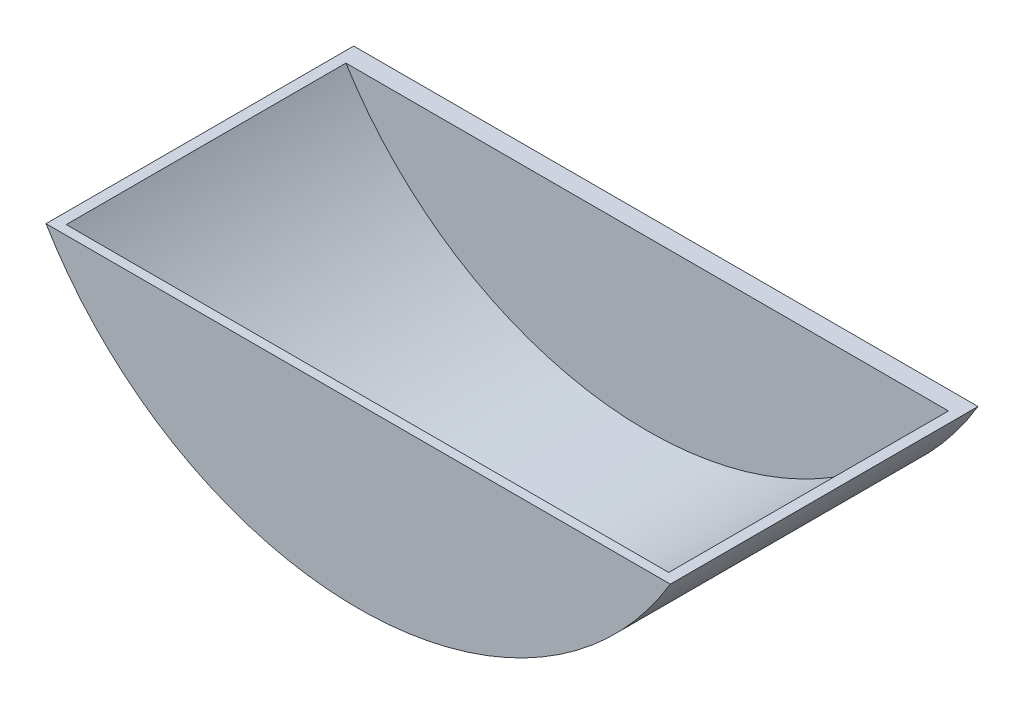
ISO-10303-21;
HEADER;
FILE_DESCRIPTION(('STEP AP214'),'2;1');
FILE_NAME('part.step','',(''),(''),'','','');
FILE_SCHEMA(('AUTOMOTIVE_DESIGN { 1 0 10303 214 1 1 1 1 }'));
ENDSEC;
DATA;
#1=APPLICATION_CONTEXT('core data for automotive mechanical design processes');
#2=APPLICATION_PROTOCOL_DEFINITION('international standard','automotive_design',2000,#1);
#3=PRODUCT_CONTEXT('',#1,'mechanical');
#4=PRODUCT('Part','Part','',(#3));
#5=PRODUCT_RELATED_PRODUCT_CATEGORY('part','',(#4));
#6=PRODUCT_DEFINITION_FORMATION('','',#4);
#7=PRODUCT_DEFINITION_CONTEXT('part definition',#1,'design');
#8=PRODUCT_DEFINITION('design','',#6,#7);
#9=PRODUCT_DEFINITION_SHAPE('','',#8);
#10=(LENGTH_UNIT() NAMED_UNIT(*) SI_UNIT(.MILLI.,.METRE.));
#11=(NAMED_UNIT(*) PLANE_ANGLE_UNIT() SI_UNIT($,.RADIAN.));
#12=(NAMED_UNIT(*) SI_UNIT($,.STERADIAN.) SOLID_ANGLE_UNIT());
#13=UNCERTAINTY_MEASURE_WITH_UNIT(LENGTH_MEASURE(1.E-05),#10,'distance_accuracy_value','');
#14=(GEOMETRIC_REPRESENTATION_CONTEXT(3) GLOBAL_UNCERTAINTY_ASSIGNED_CONTEXT((#13)) GLOBAL_UNIT_ASSIGNED_CONTEXT((#10,
#11,#12)) REPRESENTATION_CONTEXT('',''));
#15=CARTESIAN_POINT('',(0.,0.,0.));
#16=DIRECTION('',(0.,0.,1.));
#17=DIRECTION('',(1.,0.,0.));
#18=AXIS2_PLACEMENT_3D('',#15,#16,#17);
#19=CARTESIAN_POINT('',(0.,0.,-10.));
#20=DIRECTION('',(0.,0.,-1.));
#21=DIRECTION('',(-1.,0.,0.));
#22=AXIS2_PLACEMENT_3D('',#19,#20,#21);
#23=PLANE('',#22);
#24=CARTESIAN_POINT('',(0.,0.,-10.));
#25=DIRECTION('',(0.,0.,-1.));
#26=DIRECTION('',(-1.,0.,0.));
#27=AXIS2_PLACEMENT_3D('',#24,#25,#26);
#28=CIRCLE('',#27,195.);
#29=CARTESIAN_POINT('',(167.406690427832,-100.,-10.));
#30=VERTEX_POINT('',#29);
#31=CARTESIAN_POINT('',(-167.406690427832,-100.,-10.));
#32=VERTEX_POINT('',#31);
#33=EDGE_CURVE('E165',#30,#32,#28,.T.);
#34=ORIENTED_EDGE('',*,*,#33,.T.);
#35=DIRECTION('',(1.,0.,0.));
#36=VECTOR('',#35,1.);
#37=CARTESIAN_POINT('',(167.406690427832,-100.,-10.));
#38=LINE('',#37,#36);
#39=EDGE_CURVE('E168',#32,#30,#38,.T.);
#40=ORIENTED_EDGE('',*,*,#39,.T.);
#41=EDGE_LOOP('',(#34,#40));
#42=FACE_BOUND('',#41,.T.);
#43=DIRECTION('',(-1.,0.,0.));
#44=VECTOR('',#43,1.);
#45=CARTESIAN_POINT('',(-25.0000000000001,-134.59381339713,-10.));
#46=LINE('',#45,#44);
#47=CARTESIAN_POINT('',(25.9999999999999,-134.59381339713,-10.));
#48=VERTEX_POINT('',#47);
#49=CARTESIAN_POINT('',(-26.0000000000001,-134.59381339713,-10.));
#50=VERTEX_POINT('',#49);
#51=EDGE_CURVE('E192',#48,#50,#46,.T.);
#52=ORIENTED_EDGE('',*,*,#51,.T.);
#53=DIRECTION('',(0.,1.,0.));
#54=VECTOR('',#53,1.);
#55=CARTESIAN_POINT('',(-26.0000000000001,-150.293943782804,-10.));
#56=LINE('',#55,#54);
#57=CARTESIAN_POINT('',(-26.0000000000001,-151.293943782804,-10.));
#58=VERTEX_POINT('',#57);
#59=EDGE_CURVE('E207',#50,#58,#56,.F.);
#60=ORIENTED_EDGE('',*,*,#59,.T.);
#61=DIRECTION('',(-1.,0.,0.));
#62=VECTOR('',#61,1.);
#63=CARTESIAN_POINT('',(24.9999999999999,-151.293943782804,-10.));
#64=LINE('',#63,#62);
#65=CARTESIAN_POINT('',(25.9999999999999,-151.293943782804,-10.));
#66=VERTEX_POINT('',#65);
#67=EDGE_CURVE('E205',#58,#66,#64,.F.);
#68=ORIENTED_EDGE('',*,*,#67,.T.);
#69=DIRECTION('',(0.,1.,0.));
#70=VECTOR('',#69,1.);
#71=CARTESIAN_POINT('',(25.9999999999999,0.,-10.));
#72=LINE('',#71,#70);
#73=EDGE_CURVE('E202',#66,#48,#72,.T.);
#74=ORIENTED_EDGE('',*,*,#73,.T.);
#75=EDGE_LOOP('',(#52,#60,#68,#74));
#76=FACE_BOUND('',#75,.T.);
#77=ADVANCED_FACE('F40',(#42,#76),#23,.T.);
#78=CARTESIAN_POINT('',(0.,0.,150.));
#79=DIRECTION('',(0.,0.,-1.));
#80=DIRECTION('',(-1.,0.,0.));
#81=AXIS2_PLACEMENT_3D('',#78,#79,#80);
#82=CYLINDRICAL_SURFACE('',#81,190.);
#83=CARTESIAN_POINT('',(0.,0.,0.));
#84=DIRECTION('',(0.,0.,1.));
#85=DIRECTION('',(1.,0.,0.));
#86=AXIS2_PLACEMENT_3D('',#83,#84,#85);
#87=CIRCLE('',#86,190.);
#88=CARTESIAN_POINT('',(-161.554944214035,-100.,0.));
#89=VERTEX_POINT('',#88);
#90=CARTESIAN_POINT('',(161.554944214035,-100.,0.));
#91=VERTEX_POINT('',#90);
#92=EDGE_CURVE('E171',#89,#91,#87,.T.);
#93=ORIENTED_EDGE('',*,*,#92,.F.);
#94=DIRECTION('',(0.,0.,-1.));
#95=VECTOR('',#94,1.);
#96=CARTESIAN_POINT('',(-161.554944214035,-100.,150.));
#97=LINE('',#96,#95);
#98=CARTESIAN_POINT('',(-161.554944214035,-100.,150.));
#99=VERTEX_POINT('',#98);
#100=EDGE_CURVE('E185',#99,#89,#97,.T.);
#101=ORIENTED_EDGE('',*,*,#100,.F.);
#102=CARTESIAN_POINT('',(0.,0.,150.));
#103=DIRECTION('',(0.,0.,1.));
#104=DIRECTION('',(1.,0.,0.));
#105=AXIS2_PLACEMENT_3D('',#102,#103,#104);
#106=CIRCLE('',#105,190.);
#107=CARTESIAN_POINT('',(161.554944214035,-100.,150.));
#108=VERTEX_POINT('',#107);
#109=EDGE_CURVE('E174',#99,#108,#106,.T.);
#110=ORIENTED_EDGE('',*,*,#109,.T.);
#111=DIRECTION('',(0.,0.,-1.));
#112=VECTOR('',#111,1.);
#113=CARTESIAN_POINT('',(161.554944214035,-100.,150.));
#114=LINE('',#113,#112);
#115=EDGE_CURVE('E177',#108,#91,#114,.T.);
#116=ORIENTED_EDGE('',*,*,#115,.T.);
#117=EDGE_LOOP('',(#93,#101,#110,#116));
#118=FACE_BOUND('',#117,.T.);
#119=ADVANCED_FACE('F238',(#118),#82,.F.);
#120=CARTESIAN_POINT('',(0.,0.,150.));
#121=DIRECTION('',(0.,0.,-1.));
#122=DIRECTION('',(-1.,0.,0.));
#123=AXIS2_PLACEMENT_3D('',#120,#121,#122);
#124=CYLINDRICAL_SURFACE('',#123,195.);
#125=DIRECTION('',(0.,0.,-1.));
#126=VECTOR('',#125,1.);
#127=CARTESIAN_POINT('',(-167.406690427832,-100.,150.));
#128=LINE('',#127,#126);
#129=CARTESIAN_POINT('',(-167.406690427832,-100.,155.));
#130=VERTEX_POINT('',#129);
#131=EDGE_CURVE('E183',#130,#32,#128,.T.);
#132=ORIENTED_EDGE('',*,*,#131,.T.);
#133=ORIENTED_EDGE('',*,*,#33,.F.);
#134=DIRECTION('',(0.,0.,-1.));
#135=VECTOR('',#134,1.);
#136=CARTESIAN_POINT('',(167.406690427832,-100.,150.));
#137=LINE('',#136,#135);
#138=CARTESIAN_POINT('',(167.406690427832,-100.,155.));
#139=VERTEX_POINT('',#138);
#140=EDGE_CURVE('E181',#139,#30,#137,.T.);
#141=ORIENTED_EDGE('',*,*,#140,.F.);
#142=CARTESIAN_POINT('',(0.,0.,155.));
#143=DIRECTION('',(0.,0.,1.));
#144=DIRECTION('',(1.,0.,0.));
#145=AXIS2_PLACEMENT_3D('',#142,#143,#144);
#146=CIRCLE('',#145,195.);
#147=EDGE_CURVE('E156',#130,#139,#146,.T.);
#148=ORIENTED_EDGE('',*,*,#147,.F.);
#149=EDGE_LOOP('',(#132,#133,#141,#148));
#150=FACE_BOUND('',#149,.T.);
#151=ADVANCED_FACE('F244',(#150),#124,.T.);
#152=CARTESIAN_POINT('',(0.,-100.,150.));
#153=DIRECTION('',(0.,1.,0.));
#154=DIRECTION('',(0.,0.,1.));
#155=AXIS2_PLACEMENT_3D('',#152,#153,#154);
#156=PLANE('',#155);
#157=ORIENTED_EDGE('',*,*,#131,.F.);
#158=DIRECTION('',(-1.,0.,0.));
#159=VECTOR('',#158,1.);
#160=CARTESIAN_POINT('',(-167.406690427832,-100.,155.));
#161=LINE('',#160,#159);
#162=EDGE_CURVE('E159',#139,#130,#161,.T.);
#163=ORIENTED_EDGE('',*,*,#162,.F.);
#164=ORIENTED_EDGE('',*,*,#140,.T.);
#165=ORIENTED_EDGE('',*,*,#39,.F.);
#166=EDGE_LOOP('',(#157,#163,#164,#165));
#167=FACE_BOUND('',#166,.T.);
#168=DIRECTION('',(-1.,0.,0.));
#169=VECTOR('',#168,1.);
#170=CARTESIAN_POINT('',(-167.406690427832,-100.,150.));
#171=LINE('',#170,#169);
#172=EDGE_CURVE('E154',#108,#99,#171,.T.);
#173=ORIENTED_EDGE('',*,*,#172,.T.);
#174=ORIENTED_EDGE('',*,*,#100,.T.);
#175=DIRECTION('',(1.,0.,0.));
#176=VECTOR('',#175,1.);
#177=CARTESIAN_POINT('',(167.406690427832,-100.,0.));
#178=LINE('',#177,#176);
#179=EDGE_CURVE('E162',#89,#91,#178,.T.);
#180=ORIENTED_EDGE('',*,*,#179,.T.);
#181=ORIENTED_EDGE('',*,*,#115,.F.);
#182=EDGE_LOOP('',(#173,#174,#180,#181));
#183=FACE_BOUND('',#182,.T.);
#184=ADVANCED_FACE('F254',(#167,#183),#156,.T.);
#185=CARTESIAN_POINT('',(0.,0.,0.));
#186=DIRECTION('',(0.,0.,-1.));
#187=DIRECTION('',(-1.,0.,0.));
#188=AXIS2_PLACEMENT_3D('',#185,#186,#187);
#189=PLANE('',#188);
#190=ORIENTED_EDGE('',*,*,#179,.F.);
#191=ORIENTED_EDGE('',*,*,#92,.T.);
#192=EDGE_LOOP('',(#190,#191));
#193=FACE_BOUND('',#192,.T.);
#194=ADVANCED_FACE('F251',(#193),#189,.F.);
#195=CARTESIAN_POINT('',(0.,0.,150.));
#196=DIRECTION('',(0.,0.,1.));
#197=DIRECTION('',(1.,0.,0.));
#198=AXIS2_PLACEMENT_3D('',#195,#196,#197);
#199=PLANE('',#198);
#200=ORIENTED_EDGE('',*,*,#109,.F.);
#201=ORIENTED_EDGE('',*,*,#172,.F.);
#202=EDGE_LOOP('',(#200,#201));
#203=FACE_BOUND('',#202,.T.);
#204=ADVANCED_FACE('F249',(#203),#199,.F.);
#205=CARTESIAN_POINT('',(0.,0.,155.));
#206=DIRECTION('',(0.,0.,1.));
#207=DIRECTION('',(1.,0.,0.));
#208=AXIS2_PLACEMENT_3D('',#205,#206,#207);
#209=PLANE('',#208);
#210=ORIENTED_EDGE('',*,*,#147,.T.);
#211=ORIENTED_EDGE('',*,*,#162,.T.);
#212=EDGE_LOOP('',(#210,#211));
#213=FACE_BOUND('',#212,.T.);
#214=ADVANCED_FACE('F269',(#213),#209,.T.);
#215=CARTESIAN_POINT('',(-25.0000000000001,0.,-2.));
#216=DIRECTION('',(-1.,0.,0.));
#217=DIRECTION('',(0.,0.,1.));
#218=AXIS2_PLACEMENT_3D('',#215,#216,#217);
#219=PLANE('',#218);
#220=DIRECTION('',(0.,0.,-1.));
#221=VECTOR('',#220,1.);
#222=CARTESIAN_POINT('',(-25.0000000000001,-150.293943782804,-2.));
#223=LINE('',#222,#221);
#224=CARTESIAN_POINT('',(-25.0000000000001,-150.293943782804,-2.));
#225=VERTEX_POINT('',#224);
#226=CARTESIAN_POINT('',(-25.0000000000001,-150.293943782804,-9.));
#227=VERTEX_POINT('',#226);
#228=EDGE_CURVE('E138',#225,#227,#223,.T.);
#229=ORIENTED_EDGE('',*,*,#228,.T.);
#230=DIRECTION('',(0.,1.,0.));
#231=VECTOR('',#230,1.);
#232=CARTESIAN_POINT('',(-25.0000000000001,-134.59381339713,-9.));
#233=LINE('',#232,#231);
#234=CARTESIAN_POINT('',(-25.0000000000001,-136.829881374629,-9.));
#235=VERTEX_POINT('',#234);
#236=EDGE_CURVE('E64',#227,#235,#233,.T.);
#237=ORIENTED_EDGE('',*,*,#236,.T.);
#238=CARTESIAN_POINT('',(-25.0000000000001,-134.59381339713,-7.));
#239=DIRECTION('',(-1.,0.,0.));
#240=DIRECTION('',(0.,0.,1.));
#241=AXIS2_PLACEMENT_3D('',#238,#239,#240);
#242=CIRCLE('',#241,3.);
#243=CARTESIAN_POINT('',(-25.0000000000001,-137.088251654979,-8.66666666666667));
#244=VERTEX_POINT('',#243);
#245=EDGE_CURVE('E196',#235,#244,#242,.T.);
#246=ORIENTED_EDGE('',*,*,#245,.T.);
#247=CARTESIAN_POINT('',(-25.0000000000001,-149.560442944225,-17.));
#248=DIRECTION('',(-1.,0.,0.));
#249=DIRECTION('',(0.,0.,1.));
#250=AXIS2_PLACEMENT_3D('',#247,#248,#249);
#251=CIRCLE('',#250,15.);
#252=CARTESIAN_POINT('',(-25.0000000000001,-149.560442944225,-2.));
#253=VERTEX_POINT('',#252);
#254=EDGE_CURVE('E187',#244,#253,#251,.F.);
#255=ORIENTED_EDGE('',*,*,#254,.T.);
#256=DIRECTION('',(0.,1.,0.));
#257=VECTOR('',#256,1.);
#258=CARTESIAN_POINT('',(-25.0000000000001,0.,-2.));
#259=LINE('',#258,#257);
#260=EDGE_CURVE('E139',#225,#253,#259,.T.);
#261=ORIENTED_EDGE('',*,*,#260,.F.);
#262=EDGE_LOOP('',(#229,#237,#246,#255,#261));
#263=FACE_BOUND('',#262,.T.);
#264=ADVANCED_FACE('F271',(#263),#219,.F.);
#265=CARTESIAN_POINT('',(0.,-150.293943782804,-2.));
#266=DIRECTION('',(0.,-1.,0.));
#267=DIRECTION('',(0.,0.,-1.));
#268=AXIS2_PLACEMENT_3D('',#265,#266,#267);
#269=PLANE('',#268);
#270=DIRECTION('',(0.,0.,-1.));
#271=VECTOR('',#270,1.);
#272=CARTESIAN_POINT('',(24.9999999999999,-150.293943782804,-2.));
#273=LINE('',#272,#271);
#274=CARTESIAN_POINT('',(24.9999999999999,-150.293943782804,-2.));
#275=VERTEX_POINT('',#274);
#276=CARTESIAN_POINT('',(24.9999999999999,-150.293943782804,-9.));
#277=VERTEX_POINT('',#276);
#278=EDGE_CURVE('E126',#275,#277,#273,.T.);
#279=ORIENTED_EDGE('',*,*,#278,.T.);
#280=DIRECTION('',(-1.,0.,0.));
#281=VECTOR('',#280,1.);
#282=CARTESIAN_POINT('',(-25.0000000000001,-150.293943782804,-9.));
#283=LINE('',#282,#281);
#284=EDGE_CURVE('E200',#277,#227,#283,.T.);
#285=ORIENTED_EDGE('',*,*,#284,.T.);
#286=ORIENTED_EDGE('',*,*,#228,.F.);
#287=DIRECTION('',(-1.,0.,0.));
#288=VECTOR('',#287,1.);
#289=CARTESIAN_POINT('',(0.,-150.293943782804,-2.));
#290=LINE('',#289,#288);
#291=EDGE_CURVE('E145',#275,#225,#290,.T.);
#292=ORIENTED_EDGE('',*,*,#291,.F.);
#293=EDGE_LOOP('',(#279,#285,#286,#292));
#294=FACE_BOUND('',#293,.T.);
#295=ADVANCED_FACE('F150',(#294),#269,.F.);
#296=CARTESIAN_POINT('',(24.9999999999999,0.,-2.));
#297=DIRECTION('',(-1.,0.,0.));
#298=DIRECTION('',(0.,0.,1.));
#299=AXIS2_PLACEMENT_3D('',#296,#297,#298);
#300=PLANE('',#299);
#301=CARTESIAN_POINT('',(24.9999999999999,-134.59381339713,-7.));
#302=DIRECTION('',(-1.,0.,0.));
#303=DIRECTION('',(0.,0.,1.));
#304=AXIS2_PLACEMENT_3D('',#301,#302,#303);
#305=CIRCLE('',#304,3.);
#306=CARTESIAN_POINT('',(24.9999999999999,-137.088251654979,-8.66666666666667));
#307=VERTEX_POINT('',#306);
#308=CARTESIAN_POINT('',(24.9999999999999,-136.829881374629,-9.));
#309=VERTEX_POINT('',#308);
#310=EDGE_CURVE('E198',#307,#309,#305,.F.);
#311=ORIENTED_EDGE('',*,*,#310,.T.);
#312=DIRECTION('',(0.,1.,0.));
#313=VECTOR('',#312,1.);
#314=CARTESIAN_POINT('',(24.9999999999999,0.,-9.));
#315=LINE('',#314,#313);
#316=EDGE_CURVE('E133',#309,#277,#315,.F.);
#317=ORIENTED_EDGE('',*,*,#316,.T.);
#318=ORIENTED_EDGE('',*,*,#278,.F.);
#319=DIRECTION('',(0.,1.,0.));
#320=VECTOR('',#319,1.);
#321=CARTESIAN_POINT('',(24.9999999999999,0.,-2.));
#322=LINE('',#321,#320);
#323=CARTESIAN_POINT('',(24.9999999999999,-149.560442944225,-2.));
#324=VERTEX_POINT('',#323);
#325=EDGE_CURVE('E130',#275,#324,#322,.T.);
#326=ORIENTED_EDGE('',*,*,#325,.T.);
#327=CARTESIAN_POINT('',(24.9999999999999,-149.560442944225,-17.));
#328=DIRECTION('',(-1.,0.,0.));
#329=DIRECTION('',(0.,0.,1.));
#330=AXIS2_PLACEMENT_3D('',#327,#328,#329);
#331=CIRCLE('',#330,15.);
#332=EDGE_CURVE('E190',#324,#307,#331,.T.);
#333=ORIENTED_EDGE('',*,*,#332,.T.);
#334=EDGE_LOOP('',(#311,#317,#318,#326,#333));
#335=FACE_BOUND('',#334,.T.);
#336=ADVANCED_FACE('F128',(#335),#300,.T.);
#337=CARTESIAN_POINT('',(0.,0.,-2.));
#338=DIRECTION('',(0.,0.,-1.));
#339=DIRECTION('',(-1.,0.,0.));
#340=AXIS2_PLACEMENT_3D('',#337,#338,#339);
#341=PLANE('',#340);
#342=ORIENTED_EDGE('',*,*,#260,.T.);
#343=DIRECTION('',(-1.,0.,0.));
#344=VECTOR('',#343,1.);
#345=CARTESIAN_POINT('',(24.9999999999999,-149.560442944225,-2.));
#346=LINE('',#345,#344);
#347=EDGE_CURVE('E148',#253,#324,#346,.F.);
#348=ORIENTED_EDGE('',*,*,#347,.T.);
#349=ORIENTED_EDGE('',*,*,#325,.F.);
#350=ORIENTED_EDGE('',*,*,#291,.T.);
#351=EDGE_LOOP('',(#342,#348,#349,#350));
#352=FACE_BOUND('',#351,.T.);
#353=ADVANCED_FACE('F144',(#352),#341,.T.);
#354=CARTESIAN_POINT('',(0.,-149.560442944225,-17.));
#355=DIRECTION('',(1.,0.,0.));
#356=DIRECTION('',(0.,0.,-1.));
#357=AXIS2_PLACEMENT_3D('',#354,#355,#356);
#358=CYLINDRICAL_SURFACE('',#357,15.);
#359=ORIENTED_EDGE('',*,*,#254,.F.);
#360=DIRECTION('',(1.,0.,0.));
#361=VECTOR('',#360,1.);
#362=CARTESIAN_POINT('',(0.,-137.088251654979,-8.66666666666667));
#363=LINE('',#362,#361);
#364=EDGE_CURVE('E194',#244,#307,#363,.T.);
#365=ORIENTED_EDGE('',*,*,#364,.T.);
#366=ORIENTED_EDGE('',*,*,#332,.F.);
#367=ORIENTED_EDGE('',*,*,#347,.F.);
#368=EDGE_LOOP('',(#359,#365,#366,#367));
#369=FACE_BOUND('',#368,.T.);
#370=ADVANCED_FACE('F226',(#369),#358,.F.);
#371=CARTESIAN_POINT('',(0.,-134.59381339713,-7.));
#372=DIRECTION('',(1.,0.,0.));
#373=DIRECTION('',(0.,0.,-1.));
#374=AXIS2_PLACEMENT_3D('',#371,#372,#373);
#375=CYLINDRICAL_SURFACE('',#374,3.);
#376=ORIENTED_EDGE('',*,*,#310,.F.);
#377=ORIENTED_EDGE('',*,*,#364,.F.);
#378=ORIENTED_EDGE('',*,*,#245,.F.);
#379=CARTESIAN_POINT('',(-25.0000000000001,-136.829881374629,-9.));
#380=CARTESIAN_POINT('',(-25.0000045555108,-136.801570690837,-9.03165787721728));
#381=CARTESIAN_POINT('',(-25.001502630521,-136.772601978765,-9.06268744437701));
#382=CARTESIAN_POINT('',(-25.0071669851849,-136.713540813337,-9.12333217250572));
#383=CARTESIAN_POINT('',(-25.0113298709754,-136.683449835122,-9.15294908113599));
#384=CARTESIAN_POINT('',(-25.0272642318095,-136.592133544479,-9.23912627426627));
#385=CARTESIAN_POINT('',(-25.0424913092059,-136.529432232155,-9.2934948471067));
#386=CARTESIAN_POINT('',(-25.0924370178181,-136.358957898667,-9.4295613572291));
#387=CARTESIAN_POINT('',(-25.1333888247123,-136.248639342626,-9.50574463309727));
#388=CARTESIAN_POINT('',(-25.228187305914,-136.022585760011,-9.64123727792318));
#389=CARTESIAN_POINT('',(-25.2821131783341,-135.906821123044,-9.70043791408908));
#390=CARTESIAN_POINT('',(-25.3814590733247,-135.706098563844,-9.78766892394678));
#391=CARTESIAN_POINT('',(-25.4248612514738,-135.621861864565,-9.81976668088902));
#392=CARTESIAN_POINT('',(-25.5146643361153,-135.452300516277,-9.87593200214764));
#393=CARTESIAN_POINT('',(-25.5610667415802,-135.3669753408,-9.89999551480866));
#394=CARTESIAN_POINT('',(-25.7030365805707,-135.110375439104,-9.96040290764697));
#395=CARTESIAN_POINT('',(-25.8016660196175,-134.937895036641,-9.9852102334562));
#396=CARTESIAN_POINT('',(-25.9321423018868,-134.711356504362,-9.99818404629851));
#397=CARTESIAN_POINT('',(-25.9633277351829,-134.657332178257,-9.99981416628265));
#398=CARTESIAN_POINT('',(-25.9963484941438,-134.600137982632,-9.99999499809153));
#399=CARTESIAN_POINT('',(-25.9981742368466,-134.59697570332,-9.99999999781967));
#400=CARTESIAN_POINT('',(-26.0000000000001,-134.59381339713,-10.));
#401=B_SPLINE_CURVE_WITH_KNOTS('',3,(#379,#380,#381,#382,#383,#384,#385,#386,#387,#388,#389,
#390,#391,#392,#393,#394,#395,#396,#397,#398,#399,#400),.UNSPECIFIED.,.F.,.F.,(4,2,2,2,2,2,2,2,
2,2,4),(0.,0.127328124372196,0.254494407314552,0.50690275884799,0.925154347494182,
1.34602692875661,1.64578712718782,1.94569826663471,2.54344782717992,2.73062158792371,
2.7415760493441),.UNSPECIFIED.);
#402=EDGE_CURVE('E50',#235,#50,#401,.T.);
#403=ORIENTED_EDGE('',*,*,#402,.T.);
#404=ORIENTED_EDGE('',*,*,#51,.F.);
#405=CARTESIAN_POINT('',(24.9999999999999,-136.829881374629,-9.));
#406=CARTESIAN_POINT('',(25.0000045555107,-136.801570690837,-9.03165787721728));
#407=CARTESIAN_POINT('',(25.0015026305209,-136.772601978765,-9.06268744437701));
#408=CARTESIAN_POINT('',(25.0071669851848,-136.713540813337,-9.12333217250572));
#409=CARTESIAN_POINT('',(25.0113298709752,-136.683449835122,-9.15294908113599));
#410=CARTESIAN_POINT('',(25.0272642318094,-136.592133544479,-9.23912627426627));
#411=CARTESIAN_POINT('',(25.0424913092057,-136.529432232155,-9.2934948471067));
#412=CARTESIAN_POINT('',(25.0924370178179,-136.358957898667,-9.4295613572291));
#413=CARTESIAN_POINT('',(25.1333888247122,-136.248639342626,-9.50574463309727));
#414=CARTESIAN_POINT('',(25.2281873059138,-136.022585760011,-9.64123727792318));
#415=CARTESIAN_POINT('',(25.2821131783339,-135.906821123044,-9.70043791408908));
#416=CARTESIAN_POINT('',(25.3814590733246,-135.706098563844,-9.78766892394678));
#417=CARTESIAN_POINT('',(25.4248612514737,-135.621861864565,-9.81976668088902));
#418=CARTESIAN_POINT('',(25.5146643361151,-135.452300516277,-9.87593200214764));
#419=CARTESIAN_POINT('',(25.5610667415801,-135.3669753408,-9.89999551480866));
#420=CARTESIAN_POINT('',(25.7030365805706,-135.110375439104,-9.96040290764697));
#421=CARTESIAN_POINT('',(25.8016660196174,-134.937895036641,-9.9852102334562));
#422=CARTESIAN_POINT('',(25.9321423018867,-134.711356504362,-9.99818404629851));
#423=CARTESIAN_POINT('',(25.9633277351828,-134.657332178257,-9.99981416628265));
#424=CARTESIAN_POINT('',(25.9963484941437,-134.600137982632,-9.99999499809153));
#425=CARTESIAN_POINT('',(25.9981742368465,-134.59697570332,-9.99999999781967));
#426=CARTESIAN_POINT('',(25.9999999999999,-134.59381339713,-10.));
#427=B_SPLINE_CURVE_WITH_KNOTS('',3,(#405,#406,#407,#408,#409,#410,#411,#412,#413,#414,#415,
#416,#417,#418,#419,#420,#421,#422,#423,#424,#425,#426),.UNSPECIFIED.,.F.,.F.,(4,2,2,2,2,2,2,2,
2,2,4),(0.,0.127328124372196,0.254494407314552,0.50690275884799,0.925154347494182,
1.34602692875661,1.64578712718782,1.94569826663471,2.54344782717992,2.73062158792371,
2.7415760493441),.UNSPECIFIED.);
#428=EDGE_CURVE('E11',#48,#309,#427,.F.);
#429=ORIENTED_EDGE('',*,*,#428,.T.);
#430=EDGE_LOOP('',(#376,#377,#378,#403,#404,#429));
#431=FACE_BOUND('',#430,.T.);
#432=ADVANCED_FACE('F222',(#431),#375,.T.);
#433=CARTESIAN_POINT('',(25.9999999999999,0.,-9.));
#434=DIRECTION('',(0.,1.,0.));
#435=DIRECTION('',(0.,0.,1.));
#436=AXIS2_PLACEMENT_3D('',#433,#434,#435);
#437=CYLINDRICAL_SURFACE('',#436,1.);
#438=ORIENTED_EDGE('',*,*,#428,.F.);
#439=ORIENTED_EDGE('',*,*,#73,.F.);
#440=CARTESIAN_POINT('',(25.9999999999999,-151.293943782804,-9.));
#441=DIRECTION('',(0.707106781186547,0.707106781186547,0.));
#442=DIRECTION('',(0.707106781186547,-0.707106781186547,0.));
#443=AXIS2_PLACEMENT_3D('',#440,#441,#442);
#444=ELLIPSE('',#443,1.41421356237309,1.);
#445=EDGE_CURVE('E45',#277,#66,#444,.F.);
#446=ORIENTED_EDGE('',*,*,#445,.F.);
#447=ORIENTED_EDGE('',*,*,#316,.F.);
#448=EDGE_LOOP('',(#438,#439,#446,#447));
#449=FACE_BOUND('',#448,.T.);
#450=ADVANCED_FACE('F42',(#449),#437,.T.);
#451=CARTESIAN_POINT('',(-26.0000000000001,0.,-9.));
#452=DIRECTION('',(0.,-1.,0.));
#453=DIRECTION('',(0.,0.,-1.));
#454=AXIS2_PLACEMENT_3D('',#451,#452,#453);
#455=CYLINDRICAL_SURFACE('',#454,1.);
#456=ORIENTED_EDGE('',*,*,#402,.F.);
#457=ORIENTED_EDGE('',*,*,#236,.F.);
#458=CARTESIAN_POINT('',(-26.0000000000001,-151.293943782804,-9.));
#459=DIRECTION('',(0.707106781186547,-0.707106781186547,0.));
#460=DIRECTION('',(0.707106781186547,0.707106781186547,0.));
#461=AXIS2_PLACEMENT_3D('',#458,#459,#460);
#462=ELLIPSE('',#461,1.41421356237309,1.);
#463=EDGE_CURVE('E297',#58,#227,#462,.T.);
#464=ORIENTED_EDGE('',*,*,#463,.F.);
#465=ORIENTED_EDGE('',*,*,#59,.F.);
#466=EDGE_LOOP('',(#456,#457,#464,#465));
#467=FACE_BOUND('',#466,.T.);
#468=ADVANCED_FACE('F219',(#467),#455,.T.);
#469=CARTESIAN_POINT('',(0.,-151.293943782804,-9.));
#470=DIRECTION('',(1.,0.,0.));
#471=DIRECTION('',(0.,0.,-1.));
#472=AXIS2_PLACEMENT_3D('',#469,#470,#471);
#473=CYLINDRICAL_SURFACE('',#472,1.);
#474=ORIENTED_EDGE('',*,*,#445,.T.);
#475=ORIENTED_EDGE('',*,*,#67,.F.);
#476=ORIENTED_EDGE('',*,*,#463,.T.);
#477=ORIENTED_EDGE('',*,*,#284,.F.);
#478=EDGE_LOOP('',(#474,#475,#476,#477));
#479=FACE_BOUND('',#478,.T.);
#480=ADVANCED_FACE('F228',(#479),#473,.T.);
#481=CLOSED_SHELL('',(#77,#119,#151,#184,#194,#204,#214,#264,#295,#336,#353,#370,#432,#450,#468,#480));
#482=MANIFOLD_SOLID_BREP('B2',#481);
#483=ADVANCED_BREP_SHAPE_REPRESENTATION('',(#18,#482),#14);
#484=SHAPE_DEFINITION_REPRESENTATION(#9,#483);
ENDSEC;
END-ISO-10303-21;
